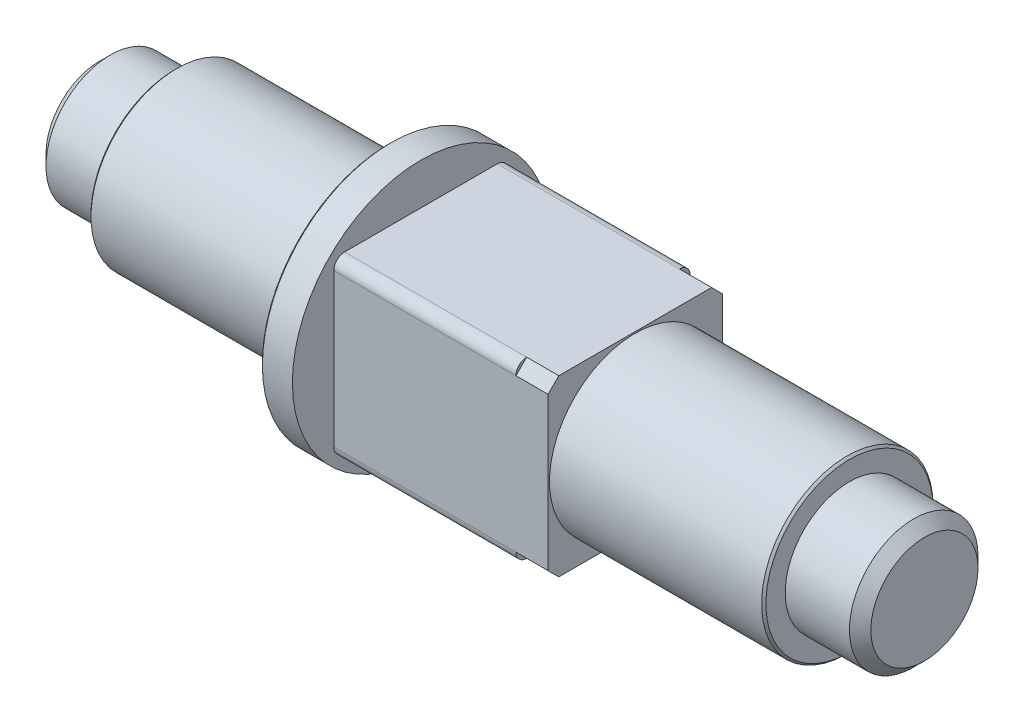
ISO-10303-21;
HEADER;
FILE_DESCRIPTION(('STEP AP214'),'2;1');
FILE_NAME('part.step','',(''),(''),'','','');
FILE_SCHEMA(('AUTOMOTIVE_DESIGN { 1 0 10303 214 1 1 1 1 }'));
ENDSEC;
DATA;
#1=APPLICATION_CONTEXT('core data for automotive mechanical design processes');
#2=APPLICATION_PROTOCOL_DEFINITION('international standard','automotive_design',2000,#1);
#3=PRODUCT_CONTEXT('',#1,'mechanical');
#4=PRODUCT('Part','Part','',(#3));
#5=PRODUCT_RELATED_PRODUCT_CATEGORY('part','',(#4));
#6=PRODUCT_DEFINITION_FORMATION('','',#4);
#7=PRODUCT_DEFINITION_CONTEXT('part definition',#1,'design');
#8=PRODUCT_DEFINITION('design','',#6,#7);
#9=PRODUCT_DEFINITION_SHAPE('','',#8);
#10=(LENGTH_UNIT() NAMED_UNIT(*) SI_UNIT(.MILLI.,.METRE.));
#11=(NAMED_UNIT(*) PLANE_ANGLE_UNIT() SI_UNIT($,.RADIAN.));
#12=(NAMED_UNIT(*) SI_UNIT($,.STERADIAN.) SOLID_ANGLE_UNIT());
#13=UNCERTAINTY_MEASURE_WITH_UNIT(LENGTH_MEASURE(1.E-05),#10,'distance_accuracy_value','');
#14=(GEOMETRIC_REPRESENTATION_CONTEXT(3) GLOBAL_UNCERTAINTY_ASSIGNED_CONTEXT((#13)) GLOBAL_UNIT_ASSIGNED_CONTEXT((#10,
#11,#12)) REPRESENTATION_CONTEXT('',''));
#15=CARTESIAN_POINT('',(0.,0.,0.));
#16=DIRECTION('',(0.,0.,1.));
#17=DIRECTION('',(1.,0.,0.));
#18=AXIS2_PLACEMENT_3D('',#15,#16,#17);
#19=CARTESIAN_POINT('',(25.,3.56586399182265,-3.56586399182265));
#20=DIRECTION('',(-1.,0.,0.));
#21=DIRECTION('',(0.,0.,1.));
#22=AXIS2_PLACEMENT_3D('',#19,#20,#21);
#23=CYLINDRICAL_SURFACE('',#22,0.5);
#24=CARTESIAN_POINT('',(23.5,3.56586399182265,-3.56586399182265));
#25=DIRECTION('',(1.,0.,0.));
#26=DIRECTION('',(0.,0.,-1.));
#27=AXIS2_PLACEMENT_3D('',#24,#25,#26);
#28=CIRCLE('',#27,0.5);
#29=CARTESIAN_POINT('',(23.5,3.56586399182265,-4.06586399182265));
#30=VERTEX_POINT('',#29);
#31=CARTESIAN_POINT('',(23.5,4.06586399182265,-3.56586399182265));
#32=VERTEX_POINT('',#31);
#33=EDGE_CURVE('E138',#30,#32,#28,.T.);
#34=ORIENTED_EDGE('',*,*,#33,.F.);
#35=DIRECTION('',(-1.,0.,0.));
#36=VECTOR('',#35,1.);
#37=CARTESIAN_POINT('',(25.,3.56586399182264,-4.06586399182265));
#38=LINE('',#37,#36);
#39=CARTESIAN_POINT('',(15.,3.56586399182264,-4.06586399182265));
#40=VERTEX_POINT('',#39);
#41=EDGE_CURVE('E226',#30,#40,#38,.T.);
#42=ORIENTED_EDGE('',*,*,#41,.T.);
#43=CARTESIAN_POINT('',(15.,3.56586399182265,-3.56586399182265));
#44=DIRECTION('',(1.,0.,0.));
#45=DIRECTION('',(0.,0.,-1.));
#46=AXIS2_PLACEMENT_3D('',#43,#44,#45);
#47=CIRCLE('',#46,0.5);
#48=CARTESIAN_POINT('',(15.,4.06586399182265,-3.56586399182264));
#49=VERTEX_POINT('',#48);
#50=EDGE_CURVE('E215',#40,#49,#47,.T.);
#51=ORIENTED_EDGE('',*,*,#50,.T.);
#52=DIRECTION('',(-1.,0.,0.));
#53=VECTOR('',#52,1.);
#54=CARTESIAN_POINT('',(25.,4.06586399182265,-3.56586399182264));
#55=LINE('',#54,#53);
#56=EDGE_CURVE('E213',#32,#49,#55,.T.);
#57=ORIENTED_EDGE('',*,*,#56,.F.);
#58=EDGE_LOOP('',(#34,#42,#51,#57));
#59=FACE_BOUND('',#58,.T.);
#60=ADVANCED_FACE('F35',(#59),#23,.T.);
#61=CARTESIAN_POINT('',(25.,-3.56586399182265,-3.56586399182265));
#62=DIRECTION('',(-1.,0.,0.));
#63=DIRECTION('',(0.,0.,1.));
#64=AXIS2_PLACEMENT_3D('',#61,#62,#63);
#65=CYLINDRICAL_SURFACE('',#64,0.5);
#66=CARTESIAN_POINT('',(23.5,-3.56586399182265,-3.56586399182265));
#67=DIRECTION('',(1.,0.,0.));
#68=DIRECTION('',(0.,0.,-1.));
#69=AXIS2_PLACEMENT_3D('',#66,#67,#68);
#70=CIRCLE('',#69,0.5);
#71=CARTESIAN_POINT('',(23.5,-4.06586399182265,-3.56586399182265));
#72=VERTEX_POINT('',#71);
#73=CARTESIAN_POINT('',(23.5,-3.56586399182265,-4.06586399182265));
#74=VERTEX_POINT('',#73);
#75=EDGE_CURVE('E189',#72,#74,#70,.T.);
#76=ORIENTED_EDGE('',*,*,#75,.F.);
#77=DIRECTION('',(-1.,0.,0.));
#78=VECTOR('',#77,1.);
#79=CARTESIAN_POINT('',(25.,-4.06586399182265,-3.56586399182265));
#80=LINE('',#79,#78);
#81=CARTESIAN_POINT('',(15.,-4.06586399182265,-3.56586399182265));
#82=VERTEX_POINT('',#81);
#83=EDGE_CURVE('E233',#72,#82,#80,.T.);
#84=ORIENTED_EDGE('',*,*,#83,.T.);
#85=CARTESIAN_POINT('',(15.,-3.56586399182265,-3.56586399182265));
#86=DIRECTION('',(1.,0.,0.));
#87=DIRECTION('',(0.,0.,-1.));
#88=AXIS2_PLACEMENT_3D('',#85,#86,#87);
#89=CIRCLE('',#88,0.5);
#90=CARTESIAN_POINT('',(15.,-3.56586399182265,-4.06586399182265));
#91=VERTEX_POINT('',#90);
#92=EDGE_CURVE('E245',#82,#91,#89,.T.);
#93=ORIENTED_EDGE('',*,*,#92,.T.);
#94=DIRECTION('',(-1.,0.,0.));
#95=VECTOR('',#94,1.);
#96=CARTESIAN_POINT('',(25.,-3.56586399182265,-4.06586399182265));
#97=LINE('',#96,#95);
#98=EDGE_CURVE('E230',#74,#91,#97,.T.);
#99=ORIENTED_EDGE('',*,*,#98,.F.);
#100=EDGE_LOOP('',(#76,#84,#93,#99));
#101=FACE_BOUND('',#100,.T.);
#102=ADVANCED_FACE('F246',(#101),#65,.T.);
#103=CARTESIAN_POINT('',(15.,6.,0.));
#104=DIRECTION('',(1.,0.,0.));
#105=DIRECTION('',(0.,0.,-1.));
#106=AXIS2_PLACEMENT_3D('',#103,#104,#105);
#107=PLANE('',#106);
#108=CARTESIAN_POINT('',(15.,0.,0.));
#109=DIRECTION('',(1.,0.,0.));
#110=DIRECTION('',(0.,0.,-1.));
#111=AXIS2_PLACEMENT_3D('',#108,#109,#110);
#112=CIRCLE('',#111,6.);
#113=CARTESIAN_POINT('',(15.,0.,-6.));
#114=VERTEX_POINT('',#113);
#115=EDGE_CURVE('E159',#114,#114,#112,.T.);
#116=ORIENTED_EDGE('',*,*,#115,.T.);
#117=EDGE_LOOP('',(#116));
#118=FACE_BOUND('',#117,.T.);
#119=DIRECTION('',(0.,0.,-1.));
#120=VECTOR('',#119,1.);
#121=CARTESIAN_POINT('',(15.,-4.06586399182265,3.56586399182264));
#122=LINE('',#121,#120);
#123=CARTESIAN_POINT('',(15.,-4.06586399182265,3.56586399182264));
#124=VERTEX_POINT('',#123);
#125=EDGE_CURVE('E249',#124,#82,#122,.T.);
#126=ORIENTED_EDGE('',*,*,#125,.F.);
#127=CARTESIAN_POINT('',(15.,-3.56586399182265,3.56586399182265));
#128=DIRECTION('',(1.,0.,0.));
#129=DIRECTION('',(0.,0.,-1.));
#130=AXIS2_PLACEMENT_3D('',#127,#128,#129);
#131=CIRCLE('',#130,0.5);
#132=CARTESIAN_POINT('',(15.,-3.56586399182265,4.06586399182265));
#133=VERTEX_POINT('',#132);
#134=EDGE_CURVE('E148',#133,#124,#131,.T.);
#135=ORIENTED_EDGE('',*,*,#134,.F.);
#136=DIRECTION('',(0.,-1.,0.));
#137=VECTOR('',#136,1.);
#138=CARTESIAN_POINT('',(15.,3.56586399182264,4.06586399182265));
#139=LINE('',#138,#137);
#140=CARTESIAN_POINT('',(15.,3.56586399182264,4.06586399182265));
#141=VERTEX_POINT('',#140);
#142=EDGE_CURVE('E260',#141,#133,#139,.T.);
#143=ORIENTED_EDGE('',*,*,#142,.F.);
#144=CARTESIAN_POINT('',(15.,3.56586399182265,3.56586399182265));
#145=DIRECTION('',(1.,0.,0.));
#146=DIRECTION('',(0.,0.,1.));
#147=AXIS2_PLACEMENT_3D('',#144,#145,#146);
#148=CIRCLE('',#147,0.5);
#149=CARTESIAN_POINT('',(15.,4.06586399182265,3.56586399182264));
#150=VERTEX_POINT('',#149);
#151=EDGE_CURVE('E258',#150,#141,#148,.T.);
#152=ORIENTED_EDGE('',*,*,#151,.F.);
#153=DIRECTION('',(0.,0.,1.));
#154=VECTOR('',#153,1.);
#155=CARTESIAN_POINT('',(15.,4.06586399182265,3.56586399182264));
#156=LINE('',#155,#154);
#157=EDGE_CURVE('E253',#49,#150,#156,.T.);
#158=ORIENTED_EDGE('',*,*,#157,.F.);
#159=ORIENTED_EDGE('',*,*,#50,.F.);
#160=DIRECTION('',(0.,1.,0.));
#161=VECTOR('',#160,1.);
#162=CARTESIAN_POINT('',(15.,3.56586399182264,-4.06586399182265));
#163=LINE('',#162,#161);
#164=EDGE_CURVE('E241',#91,#40,#163,.T.);
#165=ORIENTED_EDGE('',*,*,#164,.F.);
#166=ORIENTED_EDGE('',*,*,#92,.F.);
#167=EDGE_LOOP('',(#126,#135,#143,#152,#158,#159,#165,#166));
#168=FACE_BOUND('',#167,.T.);
#169=ADVANCED_FACE('F251',(#118,#168),#107,.T.);
#170=CARTESIAN_POINT('',(0.,0.,0.));
#171=DIRECTION('',(-1.,0.,0.));
#172=DIRECTION('',(0.,0.,1.));
#173=AXIS2_PLACEMENT_3D('',#170,#171,#172);
#174=PLANE('',#173);
#175=CARTESIAN_POINT('',(0.,0.,0.));
#176=DIRECTION('',(1.,0.,0.));
#177=DIRECTION('',(0.,0.,-1.));
#178=AXIS2_PLACEMENT_3D('',#175,#176,#177);
#179=CIRCLE('',#178,2.5);
#180=CARTESIAN_POINT('',(0.,0.,-2.5));
#181=VERTEX_POINT('',#180);
#182=EDGE_CURVE('E186',#181,#181,#179,.T.);
#183=ORIENTED_EDGE('',*,*,#182,.F.);
#184=EDGE_LOOP('',(#183));
#185=FACE_BOUND('',#184,.T.);
#186=ADVANCED_FACE('F37',(#185),#174,.T.);
#187=CARTESIAN_POINT('',(0.5,0.,0.));
#188=DIRECTION('',(1.,0.,0.));
#189=DIRECTION('',(0.,0.,-1.));
#190=AXIS2_PLACEMENT_3D('',#187,#188,#189);
#191=CONICAL_SURFACE('',#190,3.,0.785398163397448);
#192=ORIENTED_EDGE('',*,*,#182,.T.);
#193=EDGE_LOOP('',(#192));
#194=FACE_BOUND('',#193,.T.);
#195=CARTESIAN_POINT('',(0.5,0.,0.));
#196=DIRECTION('',(1.,0.,0.));
#197=DIRECTION('',(0.,0.,-1.));
#198=AXIS2_PLACEMENT_3D('',#195,#196,#197);
#199=CIRCLE('',#198,3.);
#200=CARTESIAN_POINT('',(0.5,0.,-3.));
#201=VERTEX_POINT('',#200);
#202=EDGE_CURVE('E183',#201,#201,#199,.T.);
#203=ORIENTED_EDGE('',*,*,#202,.F.);
#204=EDGE_LOOP('',(#203));
#205=FACE_BOUND('',#204,.T.);
#206=ADVANCED_FACE('F378',(#194,#205),#191,.T.);
#207=CARTESIAN_POINT('',(15.,0.,0.));
#208=DIRECTION('',(1.,0.,0.));
#209=DIRECTION('',(0.,0.,-1.));
#210=AXIS2_PLACEMENT_3D('',#207,#208,#209);
#211=CYLINDRICAL_SURFACE('',#210,3.);
#212=ORIENTED_EDGE('',*,*,#202,.T.);
#213=EDGE_LOOP('',(#212));
#214=FACE_BOUND('',#213,.T.);
#215=CARTESIAN_POINT('',(3.5,0.,0.));
#216=DIRECTION('',(1.,0.,0.));
#217=DIRECTION('',(0.,0.,-1.));
#218=AXIS2_PLACEMENT_3D('',#215,#216,#217);
#219=CIRCLE('',#218,3.);
#220=CARTESIAN_POINT('',(3.5,0.,-3.));
#221=VERTEX_POINT('',#220);
#222=EDGE_CURVE('E180',#221,#221,#219,.T.);
#223=ORIENTED_EDGE('',*,*,#222,.F.);
#224=EDGE_LOOP('',(#223));
#225=FACE_BOUND('',#224,.T.);
#226=ADVANCED_FACE('F375',(#214,#225),#211,.T.);
#227=CARTESIAN_POINT('',(3.5,3.,0.));
#228=DIRECTION('',(-1.,0.,0.));
#229=DIRECTION('',(0.,0.,1.));
#230=AXIS2_PLACEMENT_3D('',#227,#228,#229);
#231=PLANE('',#230);
#232=ORIENTED_EDGE('',*,*,#222,.T.);
#233=EDGE_LOOP('',(#232));
#234=FACE_BOUND('',#233,.T.);
#235=CARTESIAN_POINT('',(3.5,0.,0.));
#236=DIRECTION('',(1.,0.,0.));
#237=DIRECTION('',(0.,0.,-1.));
#238=AXIS2_PLACEMENT_3D('',#235,#236,#237);
#239=CIRCLE('',#238,3.9);
#240=CARTESIAN_POINT('',(3.5,0.,-3.9));
#241=VERTEX_POINT('',#240);
#242=EDGE_CURVE('E177',#241,#241,#239,.T.);
#243=ORIENTED_EDGE('',*,*,#242,.F.);
#244=EDGE_LOOP('',(#243));
#245=FACE_BOUND('',#244,.T.);
#246=ADVANCED_FACE('F371',(#234,#245),#231,.T.);
#247=CARTESIAN_POINT('',(3.6,0.,0.));
#248=DIRECTION('',(1.,0.,0.));
#249=DIRECTION('',(0.,0.,-1.));
#250=AXIS2_PLACEMENT_3D('',#247,#248,#249);
#251=CONICAL_SURFACE('',#250,4.,0.78539816339745);
#252=ORIENTED_EDGE('',*,*,#242,.T.);
#253=EDGE_LOOP('',(#252));
#254=FACE_BOUND('',#253,.T.);
#255=CARTESIAN_POINT('',(3.6,0.,0.));
#256=DIRECTION('',(1.,0.,0.));
#257=DIRECTION('',(0.,0.,-1.));
#258=AXIS2_PLACEMENT_3D('',#255,#256,#257);
#259=CIRCLE('',#258,4.);
#260=CARTESIAN_POINT('',(3.6,0.,-4.));
#261=VERTEX_POINT('',#260);
#262=EDGE_CURVE('E174',#261,#261,#259,.T.);
#263=ORIENTED_EDGE('',*,*,#262,.F.);
#264=EDGE_LOOP('',(#263));
#265=FACE_BOUND('',#264,.T.);
#266=ADVANCED_FACE('F367',(#254,#265),#251,.T.);
#267=CARTESIAN_POINT('',(15.,0.,0.));
#268=DIRECTION('',(1.,0.,0.));
#269=DIRECTION('',(0.,0.,-1.));
#270=AXIS2_PLACEMENT_3D('',#267,#268,#269);
#271=CYLINDRICAL_SURFACE('',#270,4.);
#272=ORIENTED_EDGE('',*,*,#262,.T.);
#273=EDGE_LOOP('',(#272));
#274=FACE_BOUND('',#273,.T.);
#275=CARTESIAN_POINT('',(13.5,0.,0.));
#276=DIRECTION('',(1.,0.,0.));
#277=DIRECTION('',(0.,0.,-1.));
#278=AXIS2_PLACEMENT_3D('',#275,#276,#277);
#279=CIRCLE('',#278,4.);
#280=CARTESIAN_POINT('',(13.5,0.,-4.));
#281=VERTEX_POINT('',#280);
#282=EDGE_CURVE('E171',#281,#281,#279,.T.);
#283=ORIENTED_EDGE('',*,*,#282,.F.);
#284=EDGE_LOOP('',(#283));
#285=FACE_BOUND('',#284,.T.);
#286=ADVANCED_FACE('F363',(#274,#285),#271,.T.);
#287=CARTESIAN_POINT('',(13.5,4.,0.));
#288=DIRECTION('',(-1.,0.,0.));
#289=DIRECTION('',(0.,0.,1.));
#290=AXIS2_PLACEMENT_3D('',#287,#288,#289);
#291=PLANE('',#290);
#292=ORIENTED_EDGE('',*,*,#282,.T.);
#293=EDGE_LOOP('',(#292));
#294=FACE_BOUND('',#293,.T.);
#295=CARTESIAN_POINT('',(13.5,0.,0.));
#296=DIRECTION('',(1.,0.,0.));
#297=DIRECTION('',(0.,0.,-1.));
#298=AXIS2_PLACEMENT_3D('',#295,#296,#297);
#299=CIRCLE('',#298,5.9);
#300=CARTESIAN_POINT('',(13.5,0.,-5.9));
#301=VERTEX_POINT('',#300);
#302=EDGE_CURVE('E168',#301,#301,#299,.T.);
#303=ORIENTED_EDGE('',*,*,#302,.F.);
#304=EDGE_LOOP('',(#303));
#305=FACE_BOUND('',#304,.T.);
#306=ADVANCED_FACE('F359',(#294,#305),#291,.T.);
#307=CARTESIAN_POINT('',(13.6,0.,0.));
#308=DIRECTION('',(1.,0.,0.));
#309=DIRECTION('',(0.,0.,-1.));
#310=AXIS2_PLACEMENT_3D('',#307,#308,#309);
#311=CONICAL_SURFACE('',#310,6.,0.785398163397453);
#312=ORIENTED_EDGE('',*,*,#302,.T.);
#313=EDGE_LOOP('',(#312));
#314=FACE_BOUND('',#313,.T.);
#315=CARTESIAN_POINT('',(13.6,0.,0.));
#316=DIRECTION('',(1.,0.,0.));
#317=DIRECTION('',(0.,0.,-1.));
#318=AXIS2_PLACEMENT_3D('',#315,#316,#317);
#319=CIRCLE('',#318,6.);
#320=CARTESIAN_POINT('',(13.6,0.,-6.));
#321=VERTEX_POINT('',#320);
#322=EDGE_CURVE('E161',#321,#321,#319,.T.);
#323=ORIENTED_EDGE('',*,*,#322,.F.);
#324=EDGE_LOOP('',(#323));
#325=FACE_BOUND('',#324,.T.);
#326=ADVANCED_FACE('F355',(#314,#325),#311,.T.);
#327=CARTESIAN_POINT('',(15.,0.,0.));
#328=DIRECTION('',(1.,0.,0.));
#329=DIRECTION('',(0.,0.,-1.));
#330=AXIS2_PLACEMENT_3D('',#327,#328,#329);
#331=CYLINDRICAL_SURFACE('',#330,6.);
#332=ORIENTED_EDGE('',*,*,#322,.T.);
#333=EDGE_LOOP('',(#332));
#334=FACE_BOUND('',#333,.T.);
#335=ORIENTED_EDGE('',*,*,#115,.F.);
#336=EDGE_LOOP('',(#335));
#337=FACE_BOUND('',#336,.T.);
#338=ADVANCED_FACE('F349',(#334,#337),#331,.T.);
#339=CARTESIAN_POINT('',(25.,-3.56586399182265,3.56586399182265));
#340=DIRECTION('',(-1.,0.,0.));
#341=DIRECTION('',(0.,0.,1.));
#342=AXIS2_PLACEMENT_3D('',#339,#340,#341);
#343=CYLINDRICAL_SURFACE('',#342,0.5);
#344=DIRECTION('',(-1.,0.,0.));
#345=VECTOR('',#344,1.);
#346=CARTESIAN_POINT('',(25.,-4.06586399182265,3.56586399182264));
#347=LINE('',#346,#345);
#348=CARTESIAN_POINT('',(23.5,-4.06586399182265,3.56586399182265));
#349=VERTEX_POINT('',#348);
#350=EDGE_CURVE('E145',#349,#124,#347,.T.);
#351=ORIENTED_EDGE('',*,*,#350,.F.);
#352=CARTESIAN_POINT('',(23.5,-3.56586399182265,3.56586399182265));
#353=DIRECTION('',(-1.,0.,0.));
#354=DIRECTION('',(0.,0.,1.));
#355=AXIS2_PLACEMENT_3D('',#352,#353,#354);
#356=CIRCLE('',#355,0.5);
#357=CARTESIAN_POINT('',(23.5,-3.56586399182265,4.06586399182265));
#358=VERTEX_POINT('',#357);
#359=EDGE_CURVE('E43',#349,#358,#356,.T.);
#360=ORIENTED_EDGE('',*,*,#359,.T.);
#361=DIRECTION('',(-1.,0.,0.));
#362=VECTOR('',#361,1.);
#363=CARTESIAN_POINT('',(25.,-3.56586399182265,4.06586399182265));
#364=LINE('',#363,#362);
#365=EDGE_CURVE('E90',#358,#133,#364,.T.);
#366=ORIENTED_EDGE('',*,*,#365,.T.);
#367=ORIENTED_EDGE('',*,*,#134,.T.);
#368=EDGE_LOOP('',(#351,#360,#366,#367));
#369=FACE_BOUND('',#368,.T.);
#370=ADVANCED_FACE('F146',(#369),#343,.T.);
#371=CARTESIAN_POINT('',(25.,-4.06586399182265,3.56586399182264));
#372=DIRECTION('',(0.,1.,0.));
#373=DIRECTION('',(0.,0.,1.));
#374=AXIS2_PLACEMENT_3D('',#371,#372,#373);
#375=PLANE('',#374);
#376=ORIENTED_EDGE('',*,*,#125,.T.);
#377=ORIENTED_EDGE('',*,*,#83,.F.);
#378=CARTESIAN_POINT('',(25.,-4.06586399182265,-3.56586399182265));
#379=VERTEX_POINT('',#378);
#380=EDGE_CURVE('E152',#379,#72,#80,.T.);
#381=ORIENTED_EDGE('',*,*,#380,.F.);
#382=DIRECTION('',(0.,0.,-1.));
#383=VECTOR('',#382,1.);
#384=CARTESIAN_POINT('',(25.,-4.06586399182265,3.56586399182264));
#385=LINE('',#384,#383);
#386=CARTESIAN_POINT('',(25.,-4.06586399182265,3.56586399182264));
#387=VERTEX_POINT('',#386);
#388=EDGE_CURVE('E158',#387,#379,#385,.T.);
#389=ORIENTED_EDGE('',*,*,#388,.F.);
#390=EDGE_CURVE('E97',#387,#349,#347,.T.);
#391=ORIENTED_EDGE('',*,*,#390,.T.);
#392=ORIENTED_EDGE('',*,*,#350,.T.);
#393=EDGE_LOOP('',(#376,#377,#381,#389,#391,#392));
#394=FACE_BOUND('',#393,.T.);
#395=ADVANCED_FACE('F155',(#394),#375,.F.);
#396=CARTESIAN_POINT('',(25.,3.56586399182264,-4.06586399182265));
#397=DIRECTION('',(0.,0.,1.));
#398=DIRECTION('',(0.,-1.,0.));
#399=AXIS2_PLACEMENT_3D('',#396,#397,#398);
#400=PLANE('',#399);
#401=ORIENTED_EDGE('',*,*,#164,.T.);
#402=ORIENTED_EDGE('',*,*,#41,.F.);
#403=CARTESIAN_POINT('',(25.,3.56586399182265,-4.06586399182265));
#404=VERTEX_POINT('',#403);
#405=EDGE_CURVE('E209',#404,#30,#38,.T.);
#406=ORIENTED_EDGE('',*,*,#405,.F.);
#407=DIRECTION('',(0.,1.,0.));
#408=VECTOR('',#407,1.);
#409=CARTESIAN_POINT('',(25.,3.56586399182264,-4.06586399182265));
#410=LINE('',#409,#408);
#411=CARTESIAN_POINT('',(25.,-3.56586399182265,-4.06586399182265));
#412=VERTEX_POINT('',#411);
#413=EDGE_CURVE('E281',#412,#404,#410,.T.);
#414=ORIENTED_EDGE('',*,*,#413,.F.);
#415=EDGE_CURVE('E231',#412,#74,#97,.T.);
#416=ORIENTED_EDGE('',*,*,#415,.T.);
#417=ORIENTED_EDGE('',*,*,#98,.T.);
#418=EDGE_LOOP('',(#401,#402,#406,#414,#416,#417));
#419=FACE_BOUND('',#418,.T.);
#420=ADVANCED_FACE('F239',(#419),#400,.F.);
#421=CARTESIAN_POINT('',(25.,4.06586399182265,3.56586399182264));
#422=DIRECTION('',(0.,-1.,0.));
#423=DIRECTION('',(0.,0.,-1.));
#424=AXIS2_PLACEMENT_3D('',#421,#422,#423);
#425=PLANE('',#424);
#426=ORIENTED_EDGE('',*,*,#157,.T.);
#427=DIRECTION('',(-1.,0.,0.));
#428=VECTOR('',#427,1.);
#429=CARTESIAN_POINT('',(25.,4.06586399182265,3.56586399182264));
#430=LINE('',#429,#428);
#431=CARTESIAN_POINT('',(23.5,4.06586399182265,3.56586399182265));
#432=VERTEX_POINT('',#431);
#433=EDGE_CURVE('E262',#432,#150,#430,.T.);
#434=ORIENTED_EDGE('',*,*,#433,.F.);
#435=CARTESIAN_POINT('',(25.,4.06586399182265,3.56586399182265));
#436=VERTEX_POINT('',#435);
#437=EDGE_CURVE('E219',#436,#432,#430,.T.);
#438=ORIENTED_EDGE('',*,*,#437,.F.);
#439=DIRECTION('',(0.,0.,1.));
#440=VECTOR('',#439,1.);
#441=CARTESIAN_POINT('',(25.,4.06586399182265,3.56586399182264));
#442=LINE('',#441,#440);
#443=CARTESIAN_POINT('',(25.,4.06586399182265,-3.56586399182264));
#444=VERTEX_POINT('',#443);
#445=EDGE_CURVE('E225',#444,#436,#442,.T.);
#446=ORIENTED_EDGE('',*,*,#445,.F.);
#447=EDGE_CURVE('E206',#444,#32,#55,.T.);
#448=ORIENTED_EDGE('',*,*,#447,.T.);
#449=ORIENTED_EDGE('',*,*,#56,.T.);
#450=EDGE_LOOP('',(#426,#434,#438,#446,#448,#449));
#451=FACE_BOUND('',#450,.T.);
#452=ADVANCED_FACE('F222',(#451),#425,.F.);
#453=CARTESIAN_POINT('',(25.,3.56586399182265,3.56586399182265));
#454=DIRECTION('',(-1.,0.,0.));
#455=DIRECTION('',(0.,0.,1.));
#456=AXIS2_PLACEMENT_3D('',#453,#454,#455);
#457=CYLINDRICAL_SURFACE('',#456,0.5);
#458=DIRECTION('',(-1.,0.,0.));
#459=VECTOR('',#458,1.);
#460=CARTESIAN_POINT('',(25.,3.56586399182264,4.06586399182265));
#461=LINE('',#460,#459);
#462=CARTESIAN_POINT('',(23.5,3.56586399182265,4.06586399182265));
#463=VERTEX_POINT('',#462);
#464=EDGE_CURVE('E50',#463,#141,#461,.T.);
#465=ORIENTED_EDGE('',*,*,#464,.F.);
#466=CARTESIAN_POINT('',(23.5,3.56586399182265,3.56586399182265));
#467=DIRECTION('',(-1.,0.,0.));
#468=DIRECTION('',(0.,0.,1.));
#469=AXIS2_PLACEMENT_3D('',#466,#467,#468);
#470=CIRCLE('',#469,0.5);
#471=EDGE_CURVE('E191',#463,#432,#470,.T.);
#472=ORIENTED_EDGE('',*,*,#471,.T.);
#473=ORIENTED_EDGE('',*,*,#433,.T.);
#474=ORIENTED_EDGE('',*,*,#151,.T.);
#475=EDGE_LOOP('',(#465,#472,#473,#474));
#476=FACE_BOUND('',#475,.T.);
#477=ADVANCED_FACE('F273',(#476),#457,.T.);
#478=CARTESIAN_POINT('',(25.,3.56586399182264,4.06586399182265));
#479=DIRECTION('',(0.,0.,-1.));
#480=DIRECTION('',(0.,1.,0.));
#481=AXIS2_PLACEMENT_3D('',#478,#479,#480);
#482=PLANE('',#481);
#483=ORIENTED_EDGE('',*,*,#142,.T.);
#484=ORIENTED_EDGE('',*,*,#365,.F.);
#485=CARTESIAN_POINT('',(25.,-3.56586399182265,4.06586399182265));
#486=VERTEX_POINT('',#485);
#487=EDGE_CURVE('E141',#486,#358,#364,.T.);
#488=ORIENTED_EDGE('',*,*,#487,.F.);
#489=DIRECTION('',(0.,-1.,0.));
#490=VECTOR('',#489,1.);
#491=CARTESIAN_POINT('',(25.,3.56586399182264,4.06586399182265));
#492=LINE('',#491,#490);
#493=CARTESIAN_POINT('',(25.,3.56586399182264,4.06586399182265));
#494=VERTEX_POINT('',#493);
#495=EDGE_CURVE('E277',#494,#486,#492,.T.);
#496=ORIENTED_EDGE('',*,*,#495,.F.);
#497=EDGE_CURVE('E58',#494,#463,#461,.T.);
#498=ORIENTED_EDGE('',*,*,#497,.T.);
#499=ORIENTED_EDGE('',*,*,#464,.T.);
#500=EDGE_LOOP('',(#483,#484,#488,#496,#498,#499));
#501=FACE_BOUND('',#500,.T.);
#502=ADVANCED_FACE('F276',(#501),#482,.F.);
#503=CARTESIAN_POINT('',(25.,-3.56586399182265,3.56586399182265));
#504=DIRECTION('',(1.,0.,0.));
#505=DIRECTION('',(0.,0.,-1.));
#506=AXIS2_PLACEMENT_3D('',#503,#504,#505);
#507=PLANE('',#506);
#508=CARTESIAN_POINT('',(25.,0.,0.));
#509=DIRECTION('',(1.,0.,0.));
#510=DIRECTION('',(0.,0.,-1.));
#511=AXIS2_PLACEMENT_3D('',#508,#509,#510);
#512=CIRCLE('',#511,4.);
#513=CARTESIAN_POINT('',(25.,0.,-4.));
#514=VERTEX_POINT('',#513);
#515=EDGE_CURVE('E11',#514,#514,#512,.T.);
#516=ORIENTED_EDGE('',*,*,#515,.F.);
#517=EDGE_LOOP('',(#516));
#518=FACE_BOUND('',#517,.T.);
#519=DIRECTION('',(0.,-0.707106781186548,-0.707106781186548));
#520=VECTOR('',#519,1.);
#521=CARTESIAN_POINT('',(25.,4.06586399182265,-3.56586399182265));
#522=LINE('',#521,#520);
#523=EDGE_CURVE('E210',#444,#404,#522,.T.);
#524=ORIENTED_EDGE('',*,*,#523,.F.);
#525=ORIENTED_EDGE('',*,*,#445,.T.);
#526=DIRECTION('',(0.,0.707106781186548,-0.707106781186548));
#527=VECTOR('',#526,1.);
#528=CARTESIAN_POINT('',(25.,3.56586399182265,4.06586399182265));
#529=LINE('',#528,#527);
#530=EDGE_CURVE('E142',#494,#436,#529,.T.);
#531=ORIENTED_EDGE('',*,*,#530,.F.);
#532=ORIENTED_EDGE('',*,*,#495,.T.);
#533=DIRECTION('',(0.,0.707106781186548,0.707106781186548));
#534=VECTOR('',#533,1.);
#535=CARTESIAN_POINT('',(25.,-3.56586399182265,4.06586399182265));
#536=LINE('',#535,#534);
#537=EDGE_CURVE('E143',#387,#486,#536,.T.);
#538=ORIENTED_EDGE('',*,*,#537,.F.);
#539=ORIENTED_EDGE('',*,*,#388,.T.);
#540=DIRECTION('',(0.,-0.707106781186548,0.707106781186548));
#541=VECTOR('',#540,1.);
#542=CARTESIAN_POINT('',(25.,-4.06586399182265,-3.56586399182265));
#543=LINE('',#542,#541);
#544=EDGE_CURVE('E271',#412,#379,#543,.T.);
#545=ORIENTED_EDGE('',*,*,#544,.F.);
#546=ORIENTED_EDGE('',*,*,#413,.T.);
#547=EDGE_LOOP('',(#524,#525,#531,#532,#538,#539,#545,#546));
#548=FACE_BOUND('',#547,.T.);
#549=ADVANCED_FACE('F298',(#518,#548),#507,.T.);
#550=CARTESIAN_POINT('',(23.5,0.,0.));
#551=DIRECTION('',(1.,0.,0.));
#552=DIRECTION('',(0.,0.,-1.));
#553=AXIS2_PLACEMENT_3D('',#550,#551,#552);
#554=PLANE('',#553);
#555=ORIENTED_EDGE('',*,*,#75,.T.);
#556=DIRECTION('',(0.,-0.707106781186548,0.707106781186548));
#557=VECTOR('',#556,1.);
#558=CARTESIAN_POINT('',(23.5,-4.06586399182265,-3.56586399182265));
#559=LINE('',#558,#557);
#560=EDGE_CURVE('E285',#74,#72,#559,.T.);
#561=ORIENTED_EDGE('',*,*,#560,.T.);
#562=EDGE_LOOP('',(#555,#561));
#563=FACE_BOUND('',#562,.T.);
#564=ADVANCED_FACE('F292',(#563),#554,.T.);
#565=CARTESIAN_POINT('',(23.5,-4.06586399182265,-3.56586399182265));
#566=DIRECTION('',(0.,0.707106781186547,0.707106781186547));
#567=DIRECTION('',(0.,-0.707106781186548,0.707106781186548));
#568=AXIS2_PLACEMENT_3D('',#565,#566,#567);
#569=PLANE('',#568);
#570=ORIENTED_EDGE('',*,*,#544,.T.);
#571=ORIENTED_EDGE('',*,*,#380,.T.);
#572=ORIENTED_EDGE('',*,*,#560,.F.);
#573=ORIENTED_EDGE('',*,*,#415,.F.);
#574=EDGE_LOOP('',(#570,#571,#572,#573));
#575=FACE_BOUND('',#574,.T.);
#576=ADVANCED_FACE('F289',(#575),#569,.F.);
#577=CARTESIAN_POINT('',(23.5,0.,0.));
#578=DIRECTION('',(-1.,0.,0.));
#579=DIRECTION('',(0.,0.,1.));
#580=AXIS2_PLACEMENT_3D('',#577,#578,#579);
#581=PLANE('',#580);
#582=DIRECTION('',(0.,0.707106781186548,-0.707106781186548));
#583=VECTOR('',#582,1.);
#584=CARTESIAN_POINT('',(23.5,3.56586399182265,4.06586399182265));
#585=LINE('',#584,#583);
#586=EDGE_CURVE('E268',#463,#432,#585,.T.);
#587=ORIENTED_EDGE('',*,*,#586,.T.);
#588=ORIENTED_EDGE('',*,*,#471,.F.);
#589=EDGE_LOOP('',(#587,#588));
#590=FACE_BOUND('',#589,.T.);
#591=ADVANCED_FACE('F270',(#590),#581,.F.);
#592=CARTESIAN_POINT('',(23.5,3.56586399182265,4.06586399182265));
#593=DIRECTION('',(0.,-0.707106781186547,-0.707106781186547));
#594=DIRECTION('',(0.,0.707106781186548,-0.707106781186548));
#595=AXIS2_PLACEMENT_3D('',#592,#593,#594);
#596=PLANE('',#595);
#597=ORIENTED_EDGE('',*,*,#530,.T.);
#598=ORIENTED_EDGE('',*,*,#437,.T.);
#599=ORIENTED_EDGE('',*,*,#586,.F.);
#600=ORIENTED_EDGE('',*,*,#497,.F.);
#601=EDGE_LOOP('',(#597,#598,#599,#600));
#602=FACE_BOUND('',#601,.T.);
#603=ADVANCED_FACE('F267',(#602),#596,.F.);
#604=CARTESIAN_POINT('',(23.5,0.,0.));
#605=DIRECTION('',(-1.,0.,0.));
#606=DIRECTION('',(0.,0.,1.));
#607=AXIS2_PLACEMENT_3D('',#604,#605,#606);
#608=PLANE('',#607);
#609=DIRECTION('',(0.,0.707106781186548,0.707106781186548));
#610=VECTOR('',#609,1.);
#611=CARTESIAN_POINT('',(23.5,-3.56586399182265,4.06586399182265));
#612=LINE('',#611,#610);
#613=EDGE_CURVE('E136',#349,#358,#612,.T.);
#614=ORIENTED_EDGE('',*,*,#613,.T.);
#615=ORIENTED_EDGE('',*,*,#359,.F.);
#616=EDGE_LOOP('',(#614,#615));
#617=FACE_BOUND('',#616,.T.);
#618=ADVANCED_FACE('F135',(#617),#608,.F.);
#619=CARTESIAN_POINT('',(23.5,-3.56586399182265,4.06586399182265));
#620=DIRECTION('',(0.,0.707106781186547,-0.707106781186547));
#621=DIRECTION('',(0.,0.707106781186548,0.707106781186548));
#622=AXIS2_PLACEMENT_3D('',#619,#620,#621);
#623=PLANE('',#622);
#624=ORIENTED_EDGE('',*,*,#537,.T.);
#625=ORIENTED_EDGE('',*,*,#487,.T.);
#626=ORIENTED_EDGE('',*,*,#613,.F.);
#627=ORIENTED_EDGE('',*,*,#390,.F.);
#628=EDGE_LOOP('',(#624,#625,#626,#627));
#629=FACE_BOUND('',#628,.T.);
#630=ADVANCED_FACE('F139',(#629),#623,.F.);
#631=CARTESIAN_POINT('',(23.5,0.,0.));
#632=DIRECTION('',(1.,0.,0.));
#633=DIRECTION('',(0.,0.,-1.));
#634=AXIS2_PLACEMENT_3D('',#631,#632,#633);
#635=PLANE('',#634);
#636=ORIENTED_EDGE('',*,*,#33,.T.);
#637=DIRECTION('',(0.,-0.707106781186548,-0.707106781186548));
#638=VECTOR('',#637,1.);
#639=CARTESIAN_POINT('',(23.5,4.06586399182265,-3.56586399182265));
#640=LINE('',#639,#638);
#641=EDGE_CURVE('E199',#32,#30,#640,.T.);
#642=ORIENTED_EDGE('',*,*,#641,.T.);
#643=EDGE_LOOP('',(#636,#642));
#644=FACE_BOUND('',#643,.T.);
#645=ADVANCED_FACE('F198',(#644),#635,.T.);
#646=CARTESIAN_POINT('',(23.5,4.06586399182265,-3.56586399182265));
#647=DIRECTION('',(0.,-0.707106781186547,0.707106781186547));
#648=DIRECTION('',(0.,-0.707106781186548,-0.707106781186548));
#649=AXIS2_PLACEMENT_3D('',#646,#647,#648);
#650=PLANE('',#649);
#651=ORIENTED_EDGE('',*,*,#523,.T.);
#652=ORIENTED_EDGE('',*,*,#405,.T.);
#653=ORIENTED_EDGE('',*,*,#641,.F.);
#654=ORIENTED_EDGE('',*,*,#447,.F.);
#655=EDGE_LOOP('',(#651,#652,#653,#654));
#656=FACE_BOUND('',#655,.T.);
#657=ADVANCED_FACE('F204',(#656),#650,.F.);
#658=CARTESIAN_POINT('',(38.5,0.,0.));
#659=DIRECTION('',(-1.,0.,0.));
#660=DIRECTION('',(0.,0.,1.));
#661=AXIS2_PLACEMENT_3D('',#658,#659,#660);
#662=CONICAL_SURFACE('',#661,2.5,0.785398163397448);
#663=CARTESIAN_POINT('',(38.,0.,0.));
#664=DIRECTION('',(1.,0.,0.));
#665=DIRECTION('',(0.,0.,-1.));
#666=AXIS2_PLACEMENT_3D('',#663,#664,#665);
#667=CIRCLE('',#666,3.);
#668=CARTESIAN_POINT('',(38.,0.,-3.));
#669=VERTEX_POINT('',#668);
#670=EDGE_CURVE('E316',#669,#669,#667,.T.);
#671=ORIENTED_EDGE('',*,*,#670,.T.);
#672=EDGE_LOOP('',(#671));
#673=FACE_BOUND('',#672,.T.);
#674=CARTESIAN_POINT('',(38.5,0.,0.));
#675=DIRECTION('',(1.,0.,0.));
#676=DIRECTION('',(0.,0.,-1.));
#677=AXIS2_PLACEMENT_3D('',#674,#675,#676);
#678=CIRCLE('',#677,2.5);
#679=CARTESIAN_POINT('',(38.5,0.,-2.5));
#680=VERTEX_POINT('',#679);
#681=EDGE_CURVE('E302',#680,#680,#678,.T.);
#682=ORIENTED_EDGE('',*,*,#681,.F.);
#683=EDGE_LOOP('',(#682));
#684=FACE_BOUND('',#683,.T.);
#685=ADVANCED_FACE('F320',(#673,#684),#662,.T.);
#686=CARTESIAN_POINT('',(38.5,2.5,0.));
#687=DIRECTION('',(1.,0.,0.));
#688=DIRECTION('',(0.,0.,-1.));
#689=AXIS2_PLACEMENT_3D('',#686,#687,#688);
#690=PLANE('',#689);
#691=ORIENTED_EDGE('',*,*,#681,.T.);
#692=EDGE_LOOP('',(#691));
#693=FACE_BOUND('',#692,.T.);
#694=ADVANCED_FACE('F536',(#693),#690,.T.);
#695=CARTESIAN_POINT('',(38.5,0.,0.));
#696=DIRECTION('',(1.,0.,0.));
#697=DIRECTION('',(0.,0.,-1.));
#698=AXIS2_PLACEMENT_3D('',#695,#696,#697);
#699=CYLINDRICAL_SURFACE('',#698,4.);
#700=ORIENTED_EDGE('',*,*,#515,.T.);
#701=EDGE_LOOP('',(#700));
#702=FACE_BOUND('',#701,.T.);
#703=CARTESIAN_POINT('',(34.9,0.,0.));
#704=DIRECTION('',(1.,0.,0.));
#705=DIRECTION('',(0.,0.,-1.));
#706=AXIS2_PLACEMENT_3D('',#703,#704,#705);
#707=CIRCLE('',#706,4.);
#708=CARTESIAN_POINT('',(34.9,0.,-4.));
#709=VERTEX_POINT('',#708);
#710=EDGE_CURVE('E304',#709,#709,#707,.T.);
#711=ORIENTED_EDGE('',*,*,#710,.F.);
#712=EDGE_LOOP('',(#711));
#713=FACE_BOUND('',#712,.T.);
#714=ADVANCED_FACE('F545',(#702,#713),#699,.T.);
#715=CARTESIAN_POINT('',(35.,0.,0.));
#716=DIRECTION('',(-1.,0.,0.));
#717=DIRECTION('',(0.,0.,1.));
#718=AXIS2_PLACEMENT_3D('',#715,#716,#717);
#719=CONICAL_SURFACE('',#718,3.9,0.785398163397433);
#720=ORIENTED_EDGE('',*,*,#710,.T.);
#721=EDGE_LOOP('',(#720));
#722=FACE_BOUND('',#721,.T.);
#723=CARTESIAN_POINT('',(35.,0.,0.));
#724=DIRECTION('',(1.,0.,0.));
#725=DIRECTION('',(0.,0.,-1.));
#726=AXIS2_PLACEMENT_3D('',#723,#724,#725);
#727=CIRCLE('',#726,3.9);
#728=CARTESIAN_POINT('',(35.,0.,-3.9));
#729=VERTEX_POINT('',#728);
#730=EDGE_CURVE('E308',#729,#729,#727,.T.);
#731=ORIENTED_EDGE('',*,*,#730,.F.);
#732=EDGE_LOOP('',(#731));
#733=FACE_BOUND('',#732,.T.);
#734=ADVANCED_FACE('F331',(#722,#733),#719,.T.);
#735=CARTESIAN_POINT('',(35.,3.9,0.));
#736=DIRECTION('',(1.,0.,0.));
#737=DIRECTION('',(0.,0.,-1.));
#738=AXIS2_PLACEMENT_3D('',#735,#736,#737);
#739=PLANE('',#738);
#740=ORIENTED_EDGE('',*,*,#730,.T.);
#741=EDGE_LOOP('',(#740));
#742=FACE_BOUND('',#741,.T.);
#743=CARTESIAN_POINT('',(35.,0.,0.));
#744=DIRECTION('',(1.,0.,0.));
#745=DIRECTION('',(0.,0.,-1.));
#746=AXIS2_PLACEMENT_3D('',#743,#744,#745);
#747=CIRCLE('',#746,3.);
#748=CARTESIAN_POINT('',(35.,0.,-3.));
#749=VERTEX_POINT('',#748);
#750=EDGE_CURVE('E313',#749,#749,#747,.T.);
#751=ORIENTED_EDGE('',*,*,#750,.F.);
#752=EDGE_LOOP('',(#751));
#753=FACE_BOUND('',#752,.T.);
#754=ADVANCED_FACE('F325',(#742,#753),#739,.T.);
#755=CARTESIAN_POINT('',(38.5,0.,0.));
#756=DIRECTION('',(1.,0.,0.));
#757=DIRECTION('',(0.,0.,-1.));
#758=AXIS2_PLACEMENT_3D('',#755,#756,#757);
#759=CYLINDRICAL_SURFACE('',#758,3.);
#760=ORIENTED_EDGE('',*,*,#750,.T.);
#761=EDGE_LOOP('',(#760));
#762=FACE_BOUND('',#761,.T.);
#763=ORIENTED_EDGE('',*,*,#670,.F.);
#764=EDGE_LOOP('',(#763));
#765=FACE_BOUND('',#764,.T.);
#766=ADVANCED_FACE('F323',(#762,#765),#759,.T.);
#767=CLOSED_SHELL('',(#60,#102,#169,#186,#206,#226,#246,#266,#286,#306,#326,#338,#370,#395,#420,
#452,#477,#502,#549,#564,#576,#591,#603,#618,#630,#645,#657,#685,#694,#714,#734,#754,#766));
#768=MANIFOLD_SOLID_BREP('B2',#767);
#769=ADVANCED_BREP_SHAPE_REPRESENTATION('',(#18,#768),#14);
#770=SHAPE_DEFINITION_REPRESENTATION(#9,#769);
ENDSEC;
END-ISO-10303-21;
